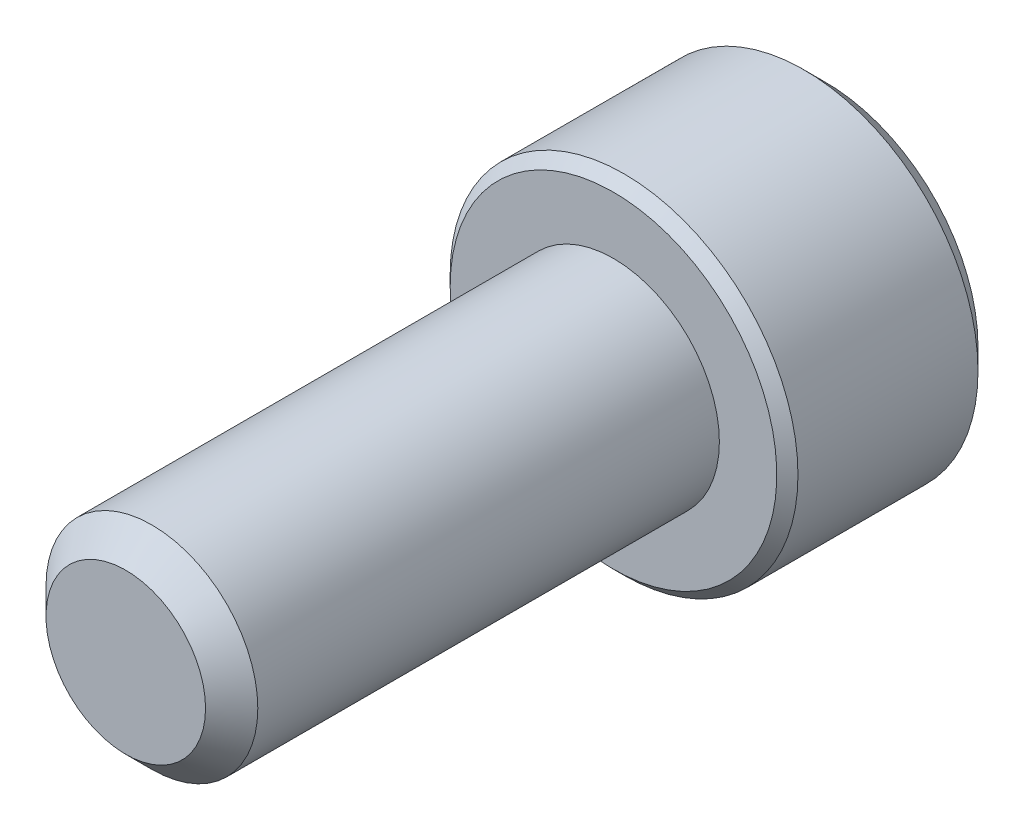
ISO-10303-21;
HEADER;
FILE_DESCRIPTION(('STEP AP214'),'2;1');
FILE_NAME('part.step','',(''),(''),'','','');
FILE_SCHEMA(('AUTOMOTIVE_DESIGN { 1 0 10303 214 1 1 1 1 }'));
ENDSEC;
DATA;
#1=APPLICATION_CONTEXT('core data for automotive mechanical design processes');
#2=APPLICATION_PROTOCOL_DEFINITION('international standard','automotive_design',2000,#1);
#3=PRODUCT_CONTEXT('',#1,'mechanical');
#4=PRODUCT('Part','Part','',(#3));
#5=PRODUCT_RELATED_PRODUCT_CATEGORY('part','',(#4));
#6=PRODUCT_DEFINITION_FORMATION('','',#4);
#7=PRODUCT_DEFINITION_CONTEXT('part definition',#1,'design');
#8=PRODUCT_DEFINITION('design','',#6,#7);
#9=PRODUCT_DEFINITION_SHAPE('','',#8);
#10=(LENGTH_UNIT() NAMED_UNIT(*) SI_UNIT(.MILLI.,.METRE.));
#11=(NAMED_UNIT(*) PLANE_ANGLE_UNIT() SI_UNIT($,.RADIAN.));
#12=(NAMED_UNIT(*) SI_UNIT($,.STERADIAN.) SOLID_ANGLE_UNIT());
#13=UNCERTAINTY_MEASURE_WITH_UNIT(LENGTH_MEASURE(1.E-05),#10,'distance_accuracy_value','');
#14=(GEOMETRIC_REPRESENTATION_CONTEXT(3) GLOBAL_UNCERTAINTY_ASSIGNED_CONTEXT((#13)) GLOBAL_UNIT_ASSIGNED_CONTEXT((#10,
#11,#12)) REPRESENTATION_CONTEXT('',''));
#15=CARTESIAN_POINT('',(0.,0.,0.));
#16=DIRECTION('',(0.,0.,1.));
#17=DIRECTION('',(1.,0.,0.));
#18=AXIS2_PLACEMENT_3D('',#15,#16,#17);
#19=CARTESIAN_POINT('',(0.,0.,-11.1125));
#20=DIRECTION('',(0.,0.,1.));
#21=DIRECTION('',(1.,0.,0.));
#22=AXIS2_PLACEMENT_3D('',#19,#20,#21);
#23=CYLINDRICAL_SURFACE('',#22,2.413);
#24=CARTESIAN_POINT('',(0.,0.,-0.595312500000004));
#25=DIRECTION('',(0.,0.,1.));
#26=DIRECTION('',(1.,0.,0.));
#27=AXIS2_PLACEMENT_3D('',#24,#25,#26);
#28=CIRCLE('',#27,2.413);
#29=CARTESIAN_POINT('',(2.413,0.,-0.595312500000004));
#30=VERTEX_POINT('',#29);
#31=EDGE_CURVE('E109',#30,#30,#28,.F.);
#32=ORIENTED_EDGE('',*,*,#31,.T.);
#33=EDGE_LOOP('',(#32));
#34=FACE_BOUND('',#33,.T.);
#35=CARTESIAN_POINT('',(0.,0.,-11.1125));
#36=DIRECTION('',(0.,0.,-1.));
#37=DIRECTION('',(-1.,0.,0.));
#38=AXIS2_PLACEMENT_3D('',#35,#36,#37);
#39=CIRCLE('',#38,2.413);
#40=CARTESIAN_POINT('',(-2.413,0.,-11.1125));
#41=VERTEX_POINT('',#40);
#42=EDGE_CURVE('E209',#41,#41,#39,.F.);
#43=ORIENTED_EDGE('',*,*,#42,.T.);
#44=EDGE_LOOP('',(#43));
#45=FACE_BOUND('',#44,.T.);
#46=ADVANCED_FACE('F35',(#34,#45),#23,.T.);
#47=CARTESIAN_POINT('',(0.,0.,0.));
#48=DIRECTION('',(0.,0.,1.));
#49=DIRECTION('',(1.,0.,0.));
#50=AXIS2_PLACEMENT_3D('',#47,#48,#49);
#51=PLANE('',#50);
#52=CARTESIAN_POINT('',(0.,0.,0.));
#53=DIRECTION('',(0.,0.,1.));
#54=DIRECTION('',(1.,0.,0.));
#55=AXIS2_PLACEMENT_3D('',#52,#53,#54);
#56=CIRCLE('',#55,1.8176875);
#57=CARTESIAN_POINT('',(1.8176875,0.,0.));
#58=VERTEX_POINT('',#57);
#59=EDGE_CURVE('E208',#58,#58,#56,.T.);
#60=ORIENTED_EDGE('',*,*,#59,.T.);
#61=EDGE_LOOP('',(#60));
#62=FACE_BOUND('',#61,.T.);
#63=ADVANCED_FACE('F186',(#62),#51,.T.);
#64=CARTESIAN_POINT('',(0.,0.,0.));
#65=DIRECTION('',(0.,0.,-1.));
#66=DIRECTION('',(-1.,0.,0.));
#67=AXIS2_PLACEMENT_3D('',#64,#65,#66);
#68=CONICAL_SURFACE('',#67,1.8176875,0.785398163397447);
#69=ORIENTED_EDGE('',*,*,#31,.F.);
#70=EDGE_LOOP('',(#69));
#71=FACE_BOUND('',#70,.T.);
#72=ORIENTED_EDGE('',*,*,#59,.F.);
#73=EDGE_LOOP('',(#72));
#74=FACE_BOUND('',#73,.T.);
#75=ADVANCED_FACE('F192',(#71,#74),#68,.T.);
#76=CARTESIAN_POINT('',(0.,0.,-15.9385));
#77=DIRECTION('',(0.,0.,1.));
#78=DIRECTION('',(1.,0.,0.));
#79=AXIS2_PLACEMENT_3D('',#76,#77,#78);
#80=CYLINDRICAL_SURFACE('',#79,3.9624);
#81=CARTESIAN_POINT('',(0.,0.,-11.3538));
#82=DIRECTION('',(0.,0.,-1.));
#83=DIRECTION('',(-1.,0.,0.));
#84=AXIS2_PLACEMENT_3D('',#81,#82,#83);
#85=CIRCLE('',#84,3.9624);
#86=CARTESIAN_POINT('',(3.9624,0.,-11.3538));
#87=VERTEX_POINT('',#86);
#88=EDGE_CURVE('E43',#87,#87,#85,.T.);
#89=CARTESIAN_POINT('',(0.,0.,-15.4559));
#90=DIRECTION('',(0.,0.,-1.));
#91=DIRECTION('',(-1.,0.,0.));
#92=AXIS2_PLACEMENT_3D('',#89,#90,#91);
#93=CIRCLE('',#92,3.9624);
#94=CARTESIAN_POINT('',(3.9624,0.,-15.4559));
#95=VERTEX_POINT('',#94);
#96=EDGE_CURVE('E169',#95,#95,#93,.F.);
#97=CARTESIAN_POINT('',(3.9624,0.,-11.3538));
#98=CARTESIAN_POINT('',(3.9624,0.,-11.3965302083333));
#99=CARTESIAN_POINT('',(3.9624,0.,-11.4392604166667));
#100=CARTESIAN_POINT('',(3.9624,0.,-11.5247208333333));
#101=CARTESIAN_POINT('',(3.9624,0.,-11.5674510416667));
#102=CARTESIAN_POINT('',(3.9624,0.,-11.6529114583333));
#103=CARTESIAN_POINT('',(3.9624,0.,-11.6956416666667));
#104=CARTESIAN_POINT('',(3.9624,0.,-11.7811020833333));
#105=CARTESIAN_POINT('',(3.9624,0.,-11.8238322916667));
#106=CARTESIAN_POINT('',(3.9624,0.,-11.9092927083333));
#107=CARTESIAN_POINT('',(3.9624,0.,-11.9520229166667));
#108=CARTESIAN_POINT('',(3.9624,0.,-12.0374833333333));
#109=CARTESIAN_POINT('',(3.9624,0.,-12.0802135416667));
#110=CARTESIAN_POINT('',(3.9624,0.,-12.1656739583333));
#111=CARTESIAN_POINT('',(3.9624,0.,-12.2084041666667));
#112=CARTESIAN_POINT('',(3.9624,0.,-12.2938645833333));
#113=CARTESIAN_POINT('',(3.9624,0.,-12.3365947916667));
#114=CARTESIAN_POINT('',(3.9624,0.,-12.4220552083333));
#115=CARTESIAN_POINT('',(3.9624,0.,-12.4647854166667));
#116=CARTESIAN_POINT('',(3.9624,0.,-12.5502458333333));
#117=CARTESIAN_POINT('',(3.9624,0.,-12.5929760416667));
#118=CARTESIAN_POINT('',(3.9624,0.,-12.6784364583333));
#119=CARTESIAN_POINT('',(3.9624,0.,-12.7211666666667));
#120=CARTESIAN_POINT('',(3.9624,0.,-12.8066270833333));
#121=CARTESIAN_POINT('',(3.9624,0.,-12.8493572916667));
#122=CARTESIAN_POINT('',(3.9624,0.,-12.9348177083333));
#123=CARTESIAN_POINT('',(3.9624,0.,-12.9775479166667));
#124=CARTESIAN_POINT('',(3.9624,0.,-13.0630083333333));
#125=CARTESIAN_POINT('',(3.9624,0.,-13.1057385416667));
#126=CARTESIAN_POINT('',(3.9624,0.,-13.1911989583333));
#127=CARTESIAN_POINT('',(3.9624,0.,-13.2339291666667));
#128=CARTESIAN_POINT('',(3.9624,0.,-13.3193895833333));
#129=CARTESIAN_POINT('',(3.9624,0.,-13.3621197916667));
#130=CARTESIAN_POINT('',(3.9624,0.,-13.4475802083333));
#131=CARTESIAN_POINT('',(3.9624,0.,-13.4903104166667));
#132=CARTESIAN_POINT('',(3.9624,0.,-13.5757708333333));
#133=CARTESIAN_POINT('',(3.9624,0.,-13.6185010416667));
#134=CARTESIAN_POINT('',(3.9624,0.,-13.7039614583333));
#135=CARTESIAN_POINT('',(3.9624,0.,-13.7466916666667));
#136=CARTESIAN_POINT('',(3.9624,0.,-13.8321520833333));
#137=CARTESIAN_POINT('',(3.9624,0.,-13.8748822916667));
#138=CARTESIAN_POINT('',(3.9624,0.,-13.9603427083333));
#139=CARTESIAN_POINT('',(3.9624,0.,-14.0030729166667));
#140=CARTESIAN_POINT('',(3.9624,0.,-14.0885333333333));
#141=CARTESIAN_POINT('',(3.9624,0.,-14.1312635416667));
#142=CARTESIAN_POINT('',(3.9624,0.,-14.2167239583333));
#143=CARTESIAN_POINT('',(3.9624,0.,-14.2594541666667));
#144=CARTESIAN_POINT('',(3.9624,0.,-14.3449145833333));
#145=CARTESIAN_POINT('',(3.9624,0.,-14.3876447916667));
#146=CARTESIAN_POINT('',(3.9624,0.,-14.4731052083333));
#147=CARTESIAN_POINT('',(3.9624,0.,-14.5158354166667));
#148=CARTESIAN_POINT('',(3.9624,0.,-14.6012958333333));
#149=CARTESIAN_POINT('',(3.9624,0.,-14.6440260416667));
#150=CARTESIAN_POINT('',(3.9624,0.,-14.7294864583333));
#151=CARTESIAN_POINT('',(3.9624,0.,-14.7722166666667));
#152=CARTESIAN_POINT('',(3.9624,0.,-14.8576770833333));
#153=CARTESIAN_POINT('',(3.9624,0.,-14.9004072916667));
#154=CARTESIAN_POINT('',(3.9624,0.,-14.9858677083333));
#155=CARTESIAN_POINT('',(3.9624,0.,-15.0285979166667));
#156=CARTESIAN_POINT('',(3.9624,0.,-15.1140583333333));
#157=CARTESIAN_POINT('',(3.9624,0.,-15.1567885416667));
#158=CARTESIAN_POINT('',(3.9624,0.,-15.2422489583333));
#159=CARTESIAN_POINT('',(3.9624,0.,-15.2849791666667));
#160=CARTESIAN_POINT('',(3.9624,0.,-15.3704395833333));
#161=CARTESIAN_POINT('',(3.9624,0.,-15.4131697916667));
#162=CARTESIAN_POINT('',(3.9624,0.,-15.4559));
#163=B_SPLINE_CURVE_WITH_KNOTS('',3,(#97,#98,#99,#100,#101,#102,#103,#104,#105,#106,#107,#108,
#109,#110,#111,#112,#113,#114,#115,#116,#117,#118,#119,#120,#121,#122,#123,#124,#125,#126,#127,
#128,#129,#130,#131,#132,#133,#134,#135,#136,#137,#138,#139,#140,#141,#142,#143,#144,#145,#146,
#147,#148,#149,#150,#151,#152,#153,#154,#155,#156,#157,#158,#159,#160,#161,#162),.UNSPECIFIED.,
.F.,.F.,(4,2,2,2,2,2,2,2,2,2,2,2,2,2,2,2,2,2,2,2,2,2,2,2,2,2,2,2,2,2,2,2,4),(0.,0.128190625,
0.256381249999998,0.384571874999998,0.512762499999998,0.640953124999998,0.769143749999998,
0.897334374999998,1.025525,1.153715625,1.28190625,1.410096875,1.5382875,1.666478125,
1.79466874999999,1.92285937499999,2.05104999999999,2.17924062499999,2.30743124999999,
2.43562187499999,2.56381249999999,2.69200312499999,2.82019374999999,2.94838437499999,
3.07657499999999,3.20476562499999,3.33295624999999,3.46114687499999,3.58933749999999,
3.71752812499999,3.84571874999999,3.97390937499999,4.10209999999999),.UNSPECIFIED.);
#164=EDGE_CURVE('BSEAM174',#87,#95,#163,.T.);
#165=ORIENTED_EDGE('',*,*,#88,.T.);
#166=ORIENTED_EDGE('',*,*,#96,.T.);
#167=ORIENTED_EDGE('',*,*,#164,.T.);
#168=ORIENTED_EDGE('',*,*,#164,.F.);
#169=EDGE_LOOP('',(#165,#167,#166,#168));
#170=FACE_BOUND('',#169,.T.);
#171=ADVANCED_FACE('F174',(#170),#80,.T.);
#172=CARTESIAN_POINT('',(0.,0.,-15.9385));
#173=DIRECTION('',(0.,0.,-1.));
#174=DIRECTION('',(-1.,0.,0.));
#175=AXIS2_PLACEMENT_3D('',#172,#173,#174);
#176=PLANE('',#175);
#177=CARTESIAN_POINT('',(0.,0.,-15.9385));
#178=DIRECTION('',(0.,0.,-1.));
#179=DIRECTION('',(-1.,0.,0.));
#180=AXIS2_PLACEMENT_3D('',#177,#178,#179);
#181=CIRCLE('',#180,3.4798);
#182=CARTESIAN_POINT('',(3.4798,0.,-15.9385));
#183=VERTEX_POINT('',#182);
#184=EDGE_CURVE('E108',#183,#183,#181,.T.);
#185=ORIENTED_EDGE('',*,*,#184,.T.);
#186=EDGE_LOOP('',(#185));
#187=FACE_BOUND('',#186,.T.);
#188=CARTESIAN_POINT('',(0.,0.,-15.9385));
#189=DIRECTION('',(0.,0.,-1.));
#190=DIRECTION('',(-1.,0.,0.));
#191=AXIS2_PLACEMENT_3D('',#188,#189,#190);
#192=CIRCLE('',#191,2.29135888084633);
#193=CARTESIAN_POINT('',(-1.984375,1.14567944042316,-15.9385));
#194=VERTEX_POINT('',#193);
#195=CARTESIAN_POINT('',(0.,2.29135888084633,-15.9385));
#196=VERTEX_POINT('',#195);
#197=EDGE_CURVE('E89',#194,#196,#192,.T.);
#198=ORIENTED_EDGE('',*,*,#197,.F.);
#199=CARTESIAN_POINT('',(-1.984375,-1.14567944042316,-15.9385));
#200=VERTEX_POINT('',#199);
#201=EDGE_CURVE('E49',#200,#194,#192,.T.);
#202=ORIENTED_EDGE('',*,*,#201,.F.);
#203=CARTESIAN_POINT('',(0.,-2.29135888084633,-15.9385));
#204=VERTEX_POINT('',#203);
#205=EDGE_CURVE('E265',#204,#200,#192,.T.);
#206=ORIENTED_EDGE('',*,*,#205,.F.);
#207=CARTESIAN_POINT('',(1.984375,-1.14567944042316,-15.9385));
#208=VERTEX_POINT('',#207);
#209=EDGE_CURVE('E56',#208,#204,#192,.T.);
#210=ORIENTED_EDGE('',*,*,#209,.F.);
#211=CARTESIAN_POINT('',(1.984375,1.14567944042316,-15.9385));
#212=VERTEX_POINT('',#211);
#213=EDGE_CURVE('E130',#212,#208,#192,.T.);
#214=ORIENTED_EDGE('',*,*,#213,.F.);
#215=EDGE_CURVE('E98',#196,#212,#192,.T.);
#216=ORIENTED_EDGE('',*,*,#215,.F.);
#217=EDGE_LOOP('',(#198,#202,#206,#210,#214,#216));
#218=FACE_BOUND('',#217,.T.);
#219=ADVANCED_FACE('F129',(#187,#218),#176,.T.);
#220=CARTESIAN_POINT('',(0.,0.,-11.1125));
#221=DIRECTION('',(0.,0.,-1.));
#222=DIRECTION('',(-1.,0.,0.));
#223=AXIS2_PLACEMENT_3D('',#220,#221,#222);
#224=PLANE('',#223);
#225=CARTESIAN_POINT('',(0.,0.,-11.1125));
#226=DIRECTION('',(0.,0.,-1.));
#227=DIRECTION('',(-1.,0.,0.));
#228=AXIS2_PLACEMENT_3D('',#225,#226,#227);
#229=CIRCLE('',#228,3.7211);
#230=CARTESIAN_POINT('',(-3.7211,0.,-11.1125));
#231=VERTEX_POINT('',#230);
#232=EDGE_CURVE('E11',#231,#231,#229,.F.);
#233=ORIENTED_EDGE('',*,*,#232,.T.);
#234=EDGE_LOOP('',(#233));
#235=FACE_BOUND('',#234,.T.);
#236=ORIENTED_EDGE('',*,*,#42,.F.);
#237=EDGE_LOOP('',(#236));
#238=FACE_BOUND('',#237,.T.);
#239=ADVANCED_FACE('F277',(#235,#238),#224,.F.);
#240=CARTESIAN_POINT('',(0.,0.,-15.9385));
#241=DIRECTION('',(0.,0.,-1.));
#242=DIRECTION('',(-1.,0.,0.));
#243=AXIS2_PLACEMENT_3D('',#240,#241,#242);
#244=CONICAL_SURFACE('',#243,2.29135888084633,0.78539816339745);
#245=ORIENTED_EDGE('',*,*,#215,.T.);
#246=CARTESIAN_POINT('',(-0.000199999999999783,2.29147435090016,-15.9386154787818));
#247=CARTESIAN_POINT('',(0.0680159951668029,2.25208982772757,-15.8992628522639));
#248=CARTESIAN_POINT('',(0.137372685106967,2.21204672412052,-15.8622213104462));
#249=CARTESIAN_POINT('',(0.278798800452188,2.13039431835551,-15.7943988584233));
#250=CARTESIAN_POINT('',(0.350881678736783,2.08877724917394,-15.7636556890918));
#251=CARTESIAN_POINT('',(0.496233397266004,2.00485839535392,-15.7109918888112));
#252=CARTESIAN_POINT('',(0.569465212486938,1.96257798712287,-15.68893887588));
#253=CARTESIAN_POINT('',(0.717541182594705,1.87708628592063,-15.6549614929439));
#254=CARTESIAN_POINT('',(0.792380812753423,1.83387760530244,-15.6430117560917));
#255=CARTESIAN_POINT('',(0.921360414543814,1.75941119748879,-15.6322300990819));
#256=CARTESIAN_POINT('',(0.975333715772441,1.72824969749539,-15.6306338990591));
#257=CARTESIAN_POINT('',(1.0831921185198,1.66597761963484,-15.6333218388653));
#258=CARTESIAN_POINT('',(1.13707718248552,1.63486706344893,-15.6376080403405));
#259=CARTESIAN_POINT('',(1.2443385382486,1.57293969082547,-15.6518168730135));
#260=CARTESIAN_POINT('',(1.29771419276014,1.54212324232506,-15.6617458104523));
#261=CARTESIAN_POINT('',(1.40354251740889,1.48102323060122,-15.6866950842745));
#262=CARTESIAN_POINT('',(1.4559952579711,1.45073962671789,-15.7017150303895));
#263=CARTESIAN_POINT('',(1.59035733896365,1.37316564308797,-15.7463078516357));
#264=CARTESIAN_POINT('',(1.67143335715832,1.32635638215845,-15.7792429959383));
#265=CARTESIAN_POINT('',(1.79064830672984,1.25752759893191,-15.8348424412022));
#266=CARTESIAN_POINT('',(1.829934924386,1.23484545965257,-15.8543775920519));
#267=CARTESIAN_POINT('',(1.90778036186805,1.18990137536713,-15.8952287381194));
#268=CARTESIAN_POINT('',(1.9463396111017,1.16763918244233,-15.9165436395683));
#269=CARTESIAN_POINT('',(1.984575,1.14556397036933,-15.9386154787818));
#270=B_SPLINE_CURVE_WITH_KNOTS('',3,(#246,#247,#248,#249,#250,#251,#252,#253,#254,#255,#256,
#257,#258,#259,#260,#261,#262,#263,#264,#265,#266,#267,#268,#269),.UNSPECIFIED.,.F.,.F.,(4,2,2,
2,2,2,2,2,2,2,2,4),(0.,0.264339630306627,0.530219665093694,0.791876416371459,1.05287424418109,
1.239639843932,1.42647091743852,1.61351120244034,1.8005371524754,2.09764209964316,
2.24579179873714,2.39385111134157),.UNSPECIFIED.);
#271=EDGE_CURVE('E103',#196,#212,#270,.T.);
#272=ORIENTED_EDGE('',*,*,#271,.F.);
#273=EDGE_LOOP('',(#245,#272));
#274=FACE_BOUND('',#273,.T.);
#275=ADVANCED_FACE('F104',(#274),#244,.F.);
#276=ORIENTED_EDGE('',*,*,#213,.T.);
#277=CARTESIAN_POINT('',(1.984375,-2.32063167832104,-16.7005122932909));
#278=CARTESIAN_POINT('',(1.984375,-2.26428478873706,-16.6576970726396));
#279=CARTESIAN_POINT('',(1.984375,-2.2076264404859,-16.6152851548598));
#280=CARTESIAN_POINT('',(1.984375,-2.09356244120113,-16.5314497614));
#281=CARTESIAN_POINT('',(1.984375,-2.03615660973826,-16.4900265314735));
#282=CARTESIAN_POINT('',(1.984375,-1.92005329549413,-16.4080556074651));
#283=CARTESIAN_POINT('',(1.984375,-1.86134925442763,-16.3675171714073));
#284=CARTESIAN_POINT('',(1.984375,-1.74295108528239,-16.2879176949279));
#285=CARTESIAN_POINT('',(1.984375,-1.68325702692775,-16.2488565510951));
#286=CARTESIAN_POINT('',(1.984375,-1.5591477373167,-16.170282507283));
#287=CARTESIAN_POINT('',(1.984375,-1.49466231059306,-16.1308799217084));
#288=CARTESIAN_POINT('',(1.984375,-1.36418150680543,-16.0546153086969));
#289=CARTESIAN_POINT('',(1.984375,-1.29818586193375,-16.0177537365827));
#290=CARTESIAN_POINT('',(1.984375,-1.16468832197213,-15.9473663044257));
#291=CARTESIAN_POINT('',(1.984375,-1.09719175474905,-15.9138304185629));
#292=CARTESIAN_POINT('',(1.984375,-0.960326048760516,-15.850838388333));
#293=CARTESIAN_POINT('',(1.984375,-0.890957548524544,-15.8213808733092));
#294=CARTESIAN_POINT('',(1.984375,-0.756350570592779,-15.7699431504382));
#295=CARTESIAN_POINT('',(1.984375,-0.691277091834669,-15.7475356001922));
#296=CARTESIAN_POINT('',(1.984375,-0.55953224434249,-15.707936438549));
#297=CARTESIAN_POINT('',(1.984375,-0.492860768840822,-15.6907451767239));
#298=CARTESIAN_POINT('',(1.984375,-0.359444340541036,-15.6627733107239));
#299=CARTESIAN_POINT('',(1.984375,-0.2927232724406,-15.6518806612626));
#300=CARTESIAN_POINT('',(1.984375,-0.158528474608846,-15.6367231339064));
#301=CARTESIAN_POINT('',(1.984375,-0.0910548851817877,-15.6324570406579));
#302=CARTESIAN_POINT('',(1.984375,0.0413650999137264,-15.6308854095573));
#303=CARTESIAN_POINT('',(1.984375,0.106308452967821,-15.6333174039186));
#304=CARTESIAN_POINT('',(1.984375,0.235655863007939,-15.6444201379429));
#305=CARTESIAN_POINT('',(1.984375,0.300059868095337,-15.6530914711624));
#306=CARTESIAN_POINT('',(1.984375,0.428953283964649,-15.6763407434725));
#307=CARTESIAN_POINT('',(1.984375,0.493424050458164,-15.6910204588315));
#308=CARTESIAN_POINT('',(1.984375,0.620952380240787,-15.7254955658159));
#309=CARTESIAN_POINT('',(1.984375,0.684010048840138,-15.7452905748402));
#310=CARTESIAN_POINT('',(1.984375,0.880940558550129,-15.8146008914478));
#311=CARTESIAN_POINT('',(1.984375,1.01205007104083,-15.871943011978));
#312=CARTESIAN_POINT('',(1.984375,1.26813381475398,-15.9994796743044));
#313=CARTESIAN_POINT('',(1.984375,1.39308407238678,-16.0697200707537));
#314=CARTESIAN_POINT('',(1.984375,1.57369086911653,-16.1793624553678));
#315=CARTESIAN_POINT('',(1.984375,1.63130328190224,-16.2156057512345));
#316=CARTESIAN_POINT('',(1.984375,1.74553911378007,-16.2896304425414));
#317=CARTESIAN_POINT('',(1.984375,1.80216245776213,-16.3274119540746));
#318=CARTESIAN_POINT('',(1.984375,1.91409137785657,-16.4039208659108));
#319=CARTESIAN_POINT('',(1.984375,1.96940390829638,-16.4426381432783));
#320=CARTESIAN_POINT('',(1.984375,2.07927192346538,-16.521101965305));
#321=CARTESIAN_POINT('',(1.984375,2.13382761241393,-16.5608482236772));
#322=CARTESIAN_POINT('',(1.984375,2.18806621147869,-16.6010161819212));
#323=B_SPLINE_CURVE_WITH_KNOTS('',3,(#277,#278,#279,#280,#281,#282,#283,#284,#285,#286,#287,
#288,#289,#290,#291,#292,#293,#294,#295,#296,#297,#298,#299,#300,#301,#302,#303,#304,#305,#306,
#307,#308,#309,#310,#311,#312,#313,#314,#315,#316,#317,#318,#319,#320,#321,#322),.UNSPECIFIED.,
.F.,.F.,(4,2,2,2,2,2,2,2,2,2,2,2,2,2,2,2,2,2,2,2,2,2,4),(0.,0.212308206697439,0.4246686475674,
0.638672731709373,0.852661807620631,1.07932739837561,1.30603350019038,1.53203394142883,
1.75795824321728,1.96424818305224,2.170551944454,2.37306294924567,2.57553680780813,
2.77019069742987,2.96486310718306,3.16297934082809,3.36108076055064,3.78913334543008,
4.21873824519345,4.4229122671498,4.62710172729377,4.8296395612553,5.03212163744055),.UNSPECIFIED.);
#324=EDGE_CURVE('E97',#212,#208,#323,.F.);
#325=ORIENTED_EDGE('',*,*,#324,.F.);
#326=EDGE_LOOP('',(#276,#325));
#327=FACE_BOUND('',#326,.T.);
#328=ADVANCED_FACE('F271',(#327),#244,.F.);
#329=ORIENTED_EDGE('',*,*,#209,.T.);
#330=CARTESIAN_POINT('',(1.984575,-1.14556397036933,-15.9386154787818));
#331=CARTESIAN_POINT('',(1.9163590048332,-1.18494849354192,-15.8992628522639));
#332=CARTESIAN_POINT('',(1.84700231489303,-1.22499159714897,-15.8622213104462));
#333=CARTESIAN_POINT('',(1.70557619954781,-1.30664400291398,-15.7943988584233));
#334=CARTESIAN_POINT('',(1.63349332126322,-1.34826107209555,-15.7636556890918));
#335=CARTESIAN_POINT('',(1.488141602734,-1.43217992591557,-15.7109918888112));
#336=CARTESIAN_POINT('',(1.41490978751306,-1.47446033414663,-15.68893887588));
#337=CARTESIAN_POINT('',(1.26683381740529,-1.55995203534886,-15.6549614929439));
#338=CARTESIAN_POINT('',(1.19199418724658,-1.60316071596705,-15.6430117560917));
#339=CARTESIAN_POINT('',(1.06301458545619,-1.6776271237807,-15.6322300990819));
#340=CARTESIAN_POINT('',(1.00904128422756,-1.7087886237741,-15.6306338990591));
#341=CARTESIAN_POINT('',(0.901182881480202,-1.77106070163465,-15.6333218388653));
#342=CARTESIAN_POINT('',(0.847297817514478,-1.80217125782056,-15.6376080403405));
#343=CARTESIAN_POINT('',(0.740036461751398,-1.86409863044402,-15.6518168730135));
#344=CARTESIAN_POINT('',(0.686660807239862,-1.89491507894443,-15.6617458104523));
#345=CARTESIAN_POINT('',(0.580832482591106,-1.95601509066827,-15.6866950842745));
#346=CARTESIAN_POINT('',(0.5283797420289,-1.9862986945516,-15.7017150303895));
#347=CARTESIAN_POINT('',(0.394017661036352,-2.06387267818152,-15.7463078516357));
#348=CARTESIAN_POINT('',(0.312941642841676,-2.11068193911104,-15.7792429959383));
#349=CARTESIAN_POINT('',(0.193726693270161,-2.17951072233758,-15.8348424412022));
#350=CARTESIAN_POINT('',(0.154440075613999,-2.20219286161692,-15.8543775920519));
#351=CARTESIAN_POINT('',(0.0765946381319474,-2.24713694590237,-15.8952287381194));
#352=CARTESIAN_POINT('',(0.0380353888983019,-2.26939913882716,-15.9165436395683));
#353=CARTESIAN_POINT('',(-0.000199999999999664,-2.29147435090017,-15.9386154787818));
#354=B_SPLINE_CURVE_WITH_KNOTS('',3,(#330,#331,#332,#333,#334,#335,#336,#337,#338,#339,#340,
#341,#342,#343,#344,#345,#346,#347,#348,#349,#350,#351,#352,#353),.UNSPECIFIED.,.F.,.F.,(4,2,2,
2,2,2,2,2,2,2,2,4),(0.,0.264339630306628,0.530219665093694,0.791876416371459,1.05287424418109,
1.239639843932,1.42647091743852,1.61351120244034,1.8005371524754,2.09764209964316,
2.24579179873714,2.39385111134157),.UNSPECIFIED.);
#355=EDGE_CURVE('E139',#208,#204,#354,.T.);
#356=ORIENTED_EDGE('',*,*,#355,.F.);
#357=EDGE_LOOP('',(#329,#356));
#358=FACE_BOUND('',#357,.T.);
#359=ADVANCED_FACE('F268',(#358),#244,.F.);
#360=ORIENTED_EDGE('',*,*,#205,.T.);
#361=CARTESIAN_POINT('',(0.000200000000000106,-2.29147435090016,-15.9386154787818));
#362=CARTESIAN_POINT('',(-0.0680159951668027,-2.25208982772757,-15.8992628522639));
#363=CARTESIAN_POINT('',(-0.137372685106966,-2.21204672412052,-15.8622213104462));
#364=CARTESIAN_POINT('',(-0.278798800452188,-2.13039431835551,-15.7943988584233));
#365=CARTESIAN_POINT('',(-0.350881678736782,-2.08877724917394,-15.7636556890918));
#366=CARTESIAN_POINT('',(-0.496233397266003,-2.00485839535392,-15.7109918888112));
#367=CARTESIAN_POINT('',(-0.569465212486938,-1.96257798712287,-15.68893887588));
#368=CARTESIAN_POINT('',(-0.717541182594705,-1.87708628592063,-15.6549614929439));
#369=CARTESIAN_POINT('',(-0.792380812753423,-1.83387760530244,-15.6430117560917));
#370=CARTESIAN_POINT('',(-0.921360414543814,-1.75941119748879,-15.6322300990819));
#371=CARTESIAN_POINT('',(-0.975333715772441,-1.72824969749539,-15.6306338990591));
#372=CARTESIAN_POINT('',(-1.0831921185198,-1.66597761963484,-15.6333218388653));
#373=CARTESIAN_POINT('',(-1.13707718248552,-1.63486706344893,-15.6376080403405));
#374=CARTESIAN_POINT('',(-1.2443385382486,-1.57293969082547,-15.6518168730135));
#375=CARTESIAN_POINT('',(-1.29771419276014,-1.54212324232506,-15.6617458104523));
#376=CARTESIAN_POINT('',(-1.40354251740889,-1.48102323060122,-15.6866950842745));
#377=CARTESIAN_POINT('',(-1.4559952579711,-1.45073962671789,-15.7017150303895));
#378=CARTESIAN_POINT('',(-1.59035733896365,-1.37316564308797,-15.7463078516357));
#379=CARTESIAN_POINT('',(-1.67143335715832,-1.32635638215845,-15.7792429959383));
#380=CARTESIAN_POINT('',(-1.79064830672984,-1.25752759893191,-15.8348424412022));
#381=CARTESIAN_POINT('',(-1.829934924386,-1.23484545965257,-15.8543775920519));
#382=CARTESIAN_POINT('',(-1.90778036186805,-1.18990137536713,-15.8952287381194));
#383=CARTESIAN_POINT('',(-1.9463396111017,-1.16763918244233,-15.9165436395683));
#384=CARTESIAN_POINT('',(-1.984575,-1.14556397036933,-15.9386154787818));
#385=B_SPLINE_CURVE_WITH_KNOTS('',3,(#361,#362,#363,#364,#365,#366,#367,#368,#369,#370,#371,
#372,#373,#374,#375,#376,#377,#378,#379,#380,#381,#382,#383,#384),.UNSPECIFIED.,.F.,.F.,(4,2,2,
2,2,2,2,2,2,2,2,4),(0.,0.264339630306627,0.530219665093694,0.791876416371459,1.05287424418109,
1.239639843932,1.42647091743852,1.61351120244034,1.8005371524754,2.09764209964316,
2.24579179873713,2.39385111134157),.UNSPECIFIED.);
#386=EDGE_CURVE('E243',#204,#200,#385,.T.);
#387=ORIENTED_EDGE('',*,*,#386,.F.);
#388=EDGE_LOOP('',(#360,#387));
#389=FACE_BOUND('',#388,.T.);
#390=ADVANCED_FACE('F267',(#389),#244,.F.);
#391=ORIENTED_EDGE('',*,*,#201,.T.);
#392=CARTESIAN_POINT('',(-1.984375,-2.32063167841241,-16.7005122933603));
#393=CARTESIAN_POINT('',(-1.984375,-2.26428478882584,-16.6576970727064));
#394=CARTESIAN_POINT('',(-1.984375,-2.20762644057208,-16.6152851549239));
#395=CARTESIAN_POINT('',(-1.984375,-2.09356244128209,-16.5314497614587));
#396=CARTESIAN_POINT('',(-1.984375,-2.03615660981659,-16.4900265315296));
#397=CARTESIAN_POINT('',(-1.984375,-1.92005329556713,-16.4080556075158));
#398=CARTESIAN_POINT('',(-1.984375,-1.86134925449792,-16.3675171714553));
#399=CARTESIAN_POINT('',(-1.984375,-1.74295108534721,-16.2879176949706));
#400=CARTESIAN_POINT('',(-1.984375,-1.68325702698981,-16.2488565511353));
#401=CARTESIAN_POINT('',(-1.984375,-1.55914773737281,-16.1702825073177));
#402=CARTESIAN_POINT('',(-1.984375,-1.49466231064596,-16.1308799217402));
#403=CARTESIAN_POINT('',(-1.984375,-1.36418150685181,-16.0546153087231));
#404=CARTESIAN_POINT('',(-1.984375,-1.29818586197681,-16.0177537366062));
#405=CARTESIAN_POINT('',(-1.984375,-1.16468832200844,-15.947366304444));
#406=CARTESIAN_POINT('',(-1.984375,-1.09719175478193,-15.9138304185787));
#407=CARTESIAN_POINT('',(-1.984375,-0.96032604878634,-15.8508383883442));
#408=CARTESIAN_POINT('',(-1.984375,-0.890957548546747,-15.8213808733182));
#409=CARTESIAN_POINT('',(-1.984375,-0.756350570613434,-15.7699431504457));
#410=CARTESIAN_POINT('',(-1.984375,-0.69127709185756,-15.7475356001998));
#411=CARTESIAN_POINT('',(-1.984375,-0.559532244369927,-15.7079364385565));
#412=CARTESIAN_POINT('',(-1.984375,-0.492860768870571,-15.6907451767311));
#413=CARTESIAN_POINT('',(-1.984375,-0.359444340575334,-15.6627733107301));
#414=CARTESIAN_POINT('',(-1.984375,-0.292723272477133,-15.651880661268));
#415=CARTESIAN_POINT('',(-1.984375,-0.158528474649783,-15.6367231339098));
#416=CARTESIAN_POINT('',(-1.984375,-0.0910548852248912,-15.6324570406599));
#417=CARTESIAN_POINT('',(-1.984375,0.0413650998667339,-15.6308854095564));
#418=CARTESIAN_POINT('',(-1.984375,0.1063084529191,-15.6333174039161));
#419=CARTESIAN_POINT('',(-1.984375,0.235655862955942,-15.6444201379368));
#420=CARTESIAN_POINT('',(-1.984375,0.300059868041792,-15.6530914711544));
#421=CARTESIAN_POINT('',(-1.984375,0.428953283908047,-15.6763407434606));
#422=CARTESIAN_POINT('',(-1.984375,0.493424050400058,-15.6910204588175));
#423=CARTESIAN_POINT('',(-1.984375,0.620952380179824,-15.7254955657978));
#424=CARTESIAN_POINT('',(-1.984375,0.684010048777822,-15.7452905748199));
#425=CARTESIAN_POINT('',(-1.984375,0.880940558474362,-15.8146008914176));
#426=CARTESIAN_POINT('',(-1.984375,1.01205007095364,-15.8719430119387));
#427=CARTESIAN_POINT('',(-1.984375,1.26813381464481,-15.9994796742459));
#428=CARTESIAN_POINT('',(-1.984375,1.39308407226708,-16.069720070685));
#429=CARTESIAN_POINT('',(-1.984375,1.5736908689822,-16.1793624552843));
#430=CARTESIAN_POINT('',(-1.984375,1.63130328176363,-16.2156057511465));
#431=CARTESIAN_POINT('',(-1.984375,1.74553911363297,-16.2896304424442));
#432=CARTESIAN_POINT('',(-1.984375,1.80216245761082,-16.3274119539728));
#433=CARTESIAN_POINT('',(-1.984375,1.91409137769693,-16.4039208658));
#434=CARTESIAN_POINT('',(-1.984375,1.96940390813262,-16.4426381431629));
#435=CARTESIAN_POINT('',(-1.984375,2.07927192329342,-16.5211019651806));
#436=CARTESIAN_POINT('',(-1.984375,2.13382761223788,-16.5608482235483));
#437=CARTESIAN_POINT('',(-1.984375,2.18806621129856,-16.6010161817877));
#438=B_SPLINE_CURVE_WITH_KNOTS('',3,(#392,#393,#394,#395,#396,#397,#398,#399,#400,#401,#402,
#403,#404,#405,#406,#407,#408,#409,#410,#411,#412,#413,#414,#415,#416,#417,#418,#419,#420,#421,
#422,#423,#424,#425,#426,#427,#428,#429,#430,#431,#432,#433,#434,#435,#436,#437),.UNSPECIFIED.,
.F.,.F.,(4,2,2,2,2,2,2,2,2,2,2,2,2,2,2,2,2,2,2,2,2,2,4),(0.,0.212308206708486,0.424668647589499,
0.638672731742731,0.852661807665247,1.07932739843287,1.30603350026028,1.53203394151127,
1.75795824331225,1.96424818314071,2.170551944536,2.37306294932147,2.57553680787772,
2.77019069749411,2.96486310724195,3.16297934088121,3.36108076059799,3.78913334543527,
4.2187382451562,4.42291226709441,4.62710172722023,4.82963956116387,5.03212163733123),.UNSPECIFIED.);
#439=EDGE_CURVE('E119',#200,#194,#438,.T.);
#440=ORIENTED_EDGE('',*,*,#439,.F.);
#441=EDGE_LOOP('',(#391,#440));
#442=FACE_BOUND('',#441,.T.);
#443=ADVANCED_FACE('F284',(#442),#244,.F.);
#444=ORIENTED_EDGE('',*,*,#197,.T.);
#445=CARTESIAN_POINT('',(-1.984575,1.14556397036933,-15.9386154787818));
#446=CARTESIAN_POINT('',(-1.9163590048332,1.18494849354192,-15.8992628522639));
#447=CARTESIAN_POINT('',(-1.84700231489303,1.22499159714897,-15.8622213104462));
#448=CARTESIAN_POINT('',(-1.70557619954781,1.30664400291398,-15.7943988584233));
#449=CARTESIAN_POINT('',(-1.63349332126322,1.34826107209555,-15.7636556890918));
#450=CARTESIAN_POINT('',(-1.488141602734,1.43217992591557,-15.7109918888112));
#451=CARTESIAN_POINT('',(-1.41490978751306,1.47446033414662,-15.68893887588));
#452=CARTESIAN_POINT('',(-1.2668338174053,1.55995203534886,-15.6549614929439));
#453=CARTESIAN_POINT('',(-1.19199418724658,1.60316071596705,-15.6430117560917));
#454=CARTESIAN_POINT('',(-1.06301458545619,1.6776271237807,-15.6322300990819));
#455=CARTESIAN_POINT('',(-1.00904128422756,1.7087886237741,-15.6306338990591));
#456=CARTESIAN_POINT('',(-0.901182881480201,1.77106070163465,-15.6333218388653));
#457=CARTESIAN_POINT('',(-0.847297817514479,1.80217125782056,-15.6376080403405));
#458=CARTESIAN_POINT('',(-0.740036461751398,1.86409863044402,-15.6518168730135));
#459=CARTESIAN_POINT('',(-0.686660807239862,1.89491507894443,-15.6617458104523));
#460=CARTESIAN_POINT('',(-0.580832482591106,1.95601509066827,-15.6866950842745));
#461=CARTESIAN_POINT('',(-0.528379742028901,1.9862986945516,-15.7017150303895));
#462=CARTESIAN_POINT('',(-0.394017661036353,2.06387267818152,-15.7463078516357));
#463=CARTESIAN_POINT('',(-0.312941642841677,2.11068193911104,-15.7792429959383));
#464=CARTESIAN_POINT('',(-0.193726693270162,2.17951072233758,-15.8348424412022));
#465=CARTESIAN_POINT('',(-0.154440075614,2.20219286161692,-15.8543775920519));
#466=CARTESIAN_POINT('',(-0.0765946381319482,2.24713694590236,-15.8952287381194));
#467=CARTESIAN_POINT('',(-0.0380353888983017,2.26939913882716,-15.9165436395683));
#468=CARTESIAN_POINT('',(0.000200000000000052,2.29147435090017,-15.9386154787818));
#469=B_SPLINE_CURVE_WITH_KNOTS('',3,(#445,#446,#447,#448,#449,#450,#451,#452,#453,#454,#455,
#456,#457,#458,#459,#460,#461,#462,#463,#464,#465,#466,#467,#468),.UNSPECIFIED.,.F.,.F.,(4,2,2,
2,2,2,2,2,2,2,2,4),(0.,0.264339630306627,0.530219665093693,0.791876416371458,1.05287424418109,
1.239639843932,1.42647091743852,1.61351120244034,1.8005371524754,2.09764209964316,
2.24579179873713,2.39385111134157),.UNSPECIFIED.);
#470=EDGE_CURVE('E93',#194,#196,#469,.T.);
#471=ORIENTED_EDGE('',*,*,#470,.F.);
#472=EDGE_LOOP('',(#444,#471));
#473=FACE_BOUND('',#472,.T.);
#474=ADVANCED_FACE('F91',(#473),#244,.F.);
#475=CARTESIAN_POINT('',(1.984375,3.43703832126949,-12.9619375));
#476=DIRECTION('',(0.,0.,-1.));
#477=DIRECTION('',(-1.,0.,0.));
#478=AXIS2_PLACEMENT_3D('',#475,#476,#477);
#479=PLANE('',#478);
#480=DIRECTION('',(0.866025403784439,0.5,0.));
#481=VECTOR('',#480,1.);
#482=CARTESIAN_POINT('',(-1.984375,1.14567944042316,-12.9619375));
#483=LINE('',#482,#481);
#484=CARTESIAN_POINT('',(-1.984375,1.14567944042316,-12.9619375));
#485=VERTEX_POINT('',#484);
#486=CARTESIAN_POINT('',(0.,2.29135888084633,-12.9619375));
#487=VERTEX_POINT('',#486);
#488=EDGE_CURVE('E118',#485,#487,#483,.T.);
#489=ORIENTED_EDGE('',*,*,#488,.T.);
#490=DIRECTION('',(0.866025403784439,-0.5,0.));
#491=VECTOR('',#490,1.);
#492=CARTESIAN_POINT('',(0.,2.29135888084633,-12.9619375));
#493=LINE('',#492,#491);
#494=CARTESIAN_POINT('',(1.984375,1.14567944042316,-12.9619375));
#495=VERTEX_POINT('',#494);
#496=EDGE_CURVE('E123',#487,#495,#493,.T.);
#497=ORIENTED_EDGE('',*,*,#496,.T.);
#498=DIRECTION('',(0.,-1.,0.));
#499=VECTOR('',#498,1.);
#500=CARTESIAN_POINT('',(1.984375,1.14567944042316,-12.9619375));
#501=LINE('',#500,#499);
#502=CARTESIAN_POINT('',(1.984375,-1.14567944042316,-12.9619375));
#503=VERTEX_POINT('',#502);
#504=EDGE_CURVE('E231',#495,#503,#501,.T.);
#505=ORIENTED_EDGE('',*,*,#504,.T.);
#506=DIRECTION('',(-0.866025403784439,-0.5,0.));
#507=VECTOR('',#506,1.);
#508=CARTESIAN_POINT('',(1.984375,-1.14567944042316,-12.9619375));
#509=LINE('',#508,#507);
#510=CARTESIAN_POINT('',(0.,-2.29135888084633,-12.9619375));
#511=VERTEX_POINT('',#510);
#512=EDGE_CURVE('E228',#503,#511,#509,.T.);
#513=ORIENTED_EDGE('',*,*,#512,.T.);
#514=DIRECTION('',(-0.866025403784439,0.5,0.));
#515=VECTOR('',#514,1.);
#516=CARTESIAN_POINT('',(0.,-2.29135888084633,-12.9619375));
#517=LINE('',#516,#515);
#518=CARTESIAN_POINT('',(-1.984375,-1.14567944042316,-12.9619375));
#519=VERTEX_POINT('',#518);
#520=EDGE_CURVE('E225',#511,#519,#517,.T.);
#521=ORIENTED_EDGE('',*,*,#520,.T.);
#522=DIRECTION('',(0.,1.,0.));
#523=VECTOR('',#522,1.);
#524=CARTESIAN_POINT('',(-1.984375,-1.14567944042316,-12.9619375));
#525=LINE('',#524,#523);
#526=EDGE_CURVE('E126',#519,#485,#525,.T.);
#527=ORIENTED_EDGE('',*,*,#526,.T.);
#528=EDGE_LOOP('',(#489,#497,#505,#513,#521,#527));
#529=FACE_BOUND('',#528,.T.);
#530=ADVANCED_FACE('F158',(#529),#479,.T.);
#531=CARTESIAN_POINT('',(0.,2.29135888084633,-12.9619375));
#532=DIRECTION('',(0.5,0.866025403784439,0.));
#533=DIRECTION('',(-0.866025403784439,0.5,0.));
#534=AXIS2_PLACEMENT_3D('',#531,#532,#533);
#535=PLANE('',#534);
#536=DIRECTION('',(0.,0.,-1.));
#537=VECTOR('',#536,1.);
#538=CARTESIAN_POINT('',(0.,2.29135888084633,-12.9619375));
#539=LINE('',#538,#537);
#540=EDGE_CURVE('E115',#487,#196,#539,.T.);
#541=ORIENTED_EDGE('',*,*,#540,.T.);
#542=ORIENTED_EDGE('',*,*,#271,.T.);
#543=DIRECTION('',(0.,0.,-1.));
#544=VECTOR('',#543,1.);
#545=CARTESIAN_POINT('',(1.984375,1.14567944042316,-12.9619375));
#546=LINE('',#545,#544);
#547=EDGE_CURVE('E125',#495,#212,#546,.T.);
#548=ORIENTED_EDGE('',*,*,#547,.F.);
#549=ORIENTED_EDGE('',*,*,#496,.F.);
#550=EDGE_LOOP('',(#541,#542,#548,#549));
#551=FACE_BOUND('',#550,.T.);
#552=ADVANCED_FACE('F121',(#551),#535,.F.);
#553=CARTESIAN_POINT('',(1.984375,1.14567944042316,-12.9619375));
#554=DIRECTION('',(1.,0.,0.));
#555=DIRECTION('',(0.,0.,-1.));
#556=AXIS2_PLACEMENT_3D('',#553,#554,#555);
#557=PLANE('',#556);
#558=ORIENTED_EDGE('',*,*,#547,.T.);
#559=ORIENTED_EDGE('',*,*,#324,.T.);
#560=DIRECTION('',(0.,0.,-1.));
#561=VECTOR('',#560,1.);
#562=CARTESIAN_POINT('',(1.984375,-1.14567944042316,-12.9619375));
#563=LINE('',#562,#561);
#564=EDGE_CURVE('E214',#503,#208,#563,.T.);
#565=ORIENTED_EDGE('',*,*,#564,.F.);
#566=ORIENTED_EDGE('',*,*,#504,.F.);
#567=EDGE_LOOP('',(#558,#559,#565,#566));
#568=FACE_BOUND('',#567,.T.);
#569=ADVANCED_FACE('F147',(#568),#557,.F.);
#570=CARTESIAN_POINT('',(1.984375,-1.14567944042316,-12.9619375));
#571=DIRECTION('',(0.5,-0.866025403784439,0.));
#572=DIRECTION('',(0.866025403784439,0.5,0.));
#573=AXIS2_PLACEMENT_3D('',#570,#571,#572);
#574=PLANE('',#573);
#575=ORIENTED_EDGE('',*,*,#564,.T.);
#576=ORIENTED_EDGE('',*,*,#355,.T.);
#577=DIRECTION('',(0.,0.,-1.));
#578=VECTOR('',#577,1.);
#579=CARTESIAN_POINT('',(0.,-2.29135888084633,-12.9619375));
#580=LINE('',#579,#578);
#581=EDGE_CURVE('E217',#511,#204,#580,.T.);
#582=ORIENTED_EDGE('',*,*,#581,.F.);
#583=ORIENTED_EDGE('',*,*,#512,.F.);
#584=EDGE_LOOP('',(#575,#576,#582,#583));
#585=FACE_BOUND('',#584,.T.);
#586=ADVANCED_FACE('F151',(#585),#574,.F.);
#587=CARTESIAN_POINT('',(0.,-2.29135888084633,-12.9619375));
#588=DIRECTION('',(-0.5,-0.866025403784439,0.));
#589=DIRECTION('',(0.866025403784439,-0.5,0.));
#590=AXIS2_PLACEMENT_3D('',#587,#588,#589);
#591=PLANE('',#590);
#592=ORIENTED_EDGE('',*,*,#581,.T.);
#593=ORIENTED_EDGE('',*,*,#386,.T.);
#594=DIRECTION('',(0.,0.,-1.));
#595=VECTOR('',#594,1.);
#596=CARTESIAN_POINT('',(-1.984375,-1.14567944042316,-12.9619375));
#597=LINE('',#596,#595);
#598=EDGE_CURVE('E220',#519,#200,#597,.T.);
#599=ORIENTED_EDGE('',*,*,#598,.F.);
#600=ORIENTED_EDGE('',*,*,#520,.F.);
#601=EDGE_LOOP('',(#592,#593,#599,#600));
#602=FACE_BOUND('',#601,.T.);
#603=ADVANCED_FACE('F250',(#602),#591,.F.);
#604=CARTESIAN_POINT('',(-1.984375,-1.14567944042316,-12.9619375));
#605=DIRECTION('',(-1.,0.,0.));
#606=DIRECTION('',(0.,-1.,0.));
#607=AXIS2_PLACEMENT_3D('',#604,#605,#606);
#608=PLANE('',#607);
#609=ORIENTED_EDGE('',*,*,#598,.T.);
#610=ORIENTED_EDGE('',*,*,#439,.T.);
#611=DIRECTION('',(0.,0.,-1.));
#612=VECTOR('',#611,1.);
#613=CARTESIAN_POINT('',(-1.984375,1.14567944042316,-12.9619375));
#614=LINE('',#613,#612);
#615=EDGE_CURVE('E117',#485,#194,#614,.T.);
#616=ORIENTED_EDGE('',*,*,#615,.F.);
#617=ORIENTED_EDGE('',*,*,#526,.F.);
#618=EDGE_LOOP('',(#609,#610,#616,#617));
#619=FACE_BOUND('',#618,.T.);
#620=ADVANCED_FACE('F247',(#619),#608,.F.);
#621=CARTESIAN_POINT('',(-1.984375,1.14567944042316,-12.9619375));
#622=DIRECTION('',(-0.5,0.866025403784439,0.));
#623=DIRECTION('',(-0.866025403784439,-0.5,0.));
#624=AXIS2_PLACEMENT_3D('',#621,#622,#623);
#625=PLANE('',#624);
#626=ORIENTED_EDGE('',*,*,#615,.T.);
#627=ORIENTED_EDGE('',*,*,#470,.T.);
#628=ORIENTED_EDGE('',*,*,#540,.F.);
#629=ORIENTED_EDGE('',*,*,#488,.F.);
#630=EDGE_LOOP('',(#626,#627,#628,#629));
#631=FACE_BOUND('',#630,.T.);
#632=ADVANCED_FACE('F113',(#631),#625,.F.);
#633=CARTESIAN_POINT('',(0.,0.,-15.9385));
#634=DIRECTION('',(0.,0.,1.));
#635=DIRECTION('',(1.,0.,0.));
#636=AXIS2_PLACEMENT_3D('',#633,#634,#635);
#637=CONICAL_SURFACE('',#636,3.4798,0.785398163397443);
#638=CARTESIAN_POINT('',(3.9624,0.,-15.4559));
#639=CARTESIAN_POINT('',(3.95737291666667,0.,-15.4609270833333));
#640=CARTESIAN_POINT('',(3.95234583333333,0.,-15.4659541666667));
#641=CARTESIAN_POINT('',(3.94229166666667,0.,-15.4760083333333));
#642=CARTESIAN_POINT('',(3.93726458333333,0.,-15.4810354166667));
#643=CARTESIAN_POINT('',(3.92721041666667,0.,-15.4910895833333));
#644=CARTESIAN_POINT('',(3.92218333333333,0.,-15.4961166666667));
#645=CARTESIAN_POINT('',(3.91212916666667,0.,-15.5061708333333));
#646=CARTESIAN_POINT('',(3.90710208333333,0.,-15.5111979166667));
#647=CARTESIAN_POINT('',(3.89704791666667,0.,-15.5212520833333));
#648=CARTESIAN_POINT('',(3.89202083333333,0.,-15.5262791666667));
#649=CARTESIAN_POINT('',(3.88196666666667,0.,-15.5363333333333));
#650=CARTESIAN_POINT('',(3.87693958333333,0.,-15.5413604166667));
#651=CARTESIAN_POINT('',(3.86688541666667,0.,-15.5514145833333));
#652=CARTESIAN_POINT('',(3.86185833333333,0.,-15.5564416666667));
#653=CARTESIAN_POINT('',(3.85180416666667,0.,-15.5664958333333));
#654=CARTESIAN_POINT('',(3.84677708333333,0.,-15.5715229166667));
#655=CARTESIAN_POINT('',(3.83672291666667,0.,-15.5815770833333));
#656=CARTESIAN_POINT('',(3.83169583333333,0.,-15.5866041666667));
#657=CARTESIAN_POINT('',(3.82164166666667,0.,-15.5966583333333));
#658=CARTESIAN_POINT('',(3.81661458333333,0.,-15.6016854166667));
#659=CARTESIAN_POINT('',(3.80656041666667,0.,-15.6117395833333));
#660=CARTESIAN_POINT('',(3.80153333333333,0.,-15.6167666666667));
#661=CARTESIAN_POINT('',(3.79147916666667,0.,-15.6268208333333));
#662=CARTESIAN_POINT('',(3.78645208333333,0.,-15.6318479166667));
#663=CARTESIAN_POINT('',(3.77639791666667,0.,-15.6419020833333));
#664=CARTESIAN_POINT('',(3.77137083333333,0.,-15.6469291666667));
#665=CARTESIAN_POINT('',(3.76131666666667,0.,-15.6569833333333));
#666=CARTESIAN_POINT('',(3.75628958333333,0.,-15.6620104166667));
#667=CARTESIAN_POINT('',(3.74623541666667,0.,-15.6720645833333));
#668=CARTESIAN_POINT('',(3.74120833333333,0.,-15.6770916666667));
#669=CARTESIAN_POINT('',(3.73115416666667,0.,-15.6871458333333));
#670=CARTESIAN_POINT('',(3.72612708333333,0.,-15.6921729166667));
#671=CARTESIAN_POINT('',(3.71607291666667,0.,-15.7022270833333));
#672=CARTESIAN_POINT('',(3.71104583333333,0.,-15.7072541666667));
#673=CARTESIAN_POINT('',(3.70099166666667,0.,-15.7173083333333));
#674=CARTESIAN_POINT('',(3.69596458333333,0.,-15.7223354166667));
#675=CARTESIAN_POINT('',(3.68591041666667,0.,-15.7323895833333));
#676=CARTESIAN_POINT('',(3.68088333333333,0.,-15.7374166666667));
#677=CARTESIAN_POINT('',(3.67082916666667,0.,-15.7474708333333));
#678=CARTESIAN_POINT('',(3.66580208333333,0.,-15.7524979166667));
#679=CARTESIAN_POINT('',(3.65574791666667,0.,-15.7625520833333));
#680=CARTESIAN_POINT('',(3.65072083333333,0.,-15.7675791666667));
#681=CARTESIAN_POINT('',(3.64066666666667,0.,-15.7776333333333));
#682=CARTESIAN_POINT('',(3.63563958333333,0.,-15.7826604166667));
#683=CARTESIAN_POINT('',(3.62558541666667,0.,-15.7927145833333));
#684=CARTESIAN_POINT('',(3.62055833333333,0.,-15.7977416666667));
#685=CARTESIAN_POINT('',(3.61050416666667,0.,-15.8077958333333));
#686=CARTESIAN_POINT('',(3.60547708333333,0.,-15.8128229166667));
#687=CARTESIAN_POINT('',(3.59542291666667,0.,-15.8228770833333));
#688=CARTESIAN_POINT('',(3.59039583333333,0.,-15.8279041666667));
#689=CARTESIAN_POINT('',(3.58034166666667,0.,-15.8379583333333));
#690=CARTESIAN_POINT('',(3.57531458333333,0.,-15.8429854166667));
#691=CARTESIAN_POINT('',(3.56526041666667,0.,-15.8530395833333));
#692=CARTESIAN_POINT('',(3.56023333333333,0.,-15.8580666666667));
#693=CARTESIAN_POINT('',(3.55017916666667,0.,-15.8681208333333));
#694=CARTESIAN_POINT('',(3.54515208333333,0.,-15.8731479166667));
#695=CARTESIAN_POINT('',(3.53509791666667,0.,-15.8832020833333));
#696=CARTESIAN_POINT('',(3.53007083333333,0.,-15.8882291666667));
#697=CARTESIAN_POINT('',(3.52001666666667,0.,-15.8982833333333));
#698=CARTESIAN_POINT('',(3.51498958333333,0.,-15.9033104166667));
#699=CARTESIAN_POINT('',(3.50493541666667,0.,-15.9133645833333));
#700=CARTESIAN_POINT('',(3.49990833333333,0.,-15.9183916666667));
#701=CARTESIAN_POINT('',(3.48985416666667,0.,-15.9284458333333));
#702=CARTESIAN_POINT('',(3.48482708333333,0.,-15.9334729166667));
#703=CARTESIAN_POINT('',(3.4798,0.,-15.9385));
#704=B_SPLINE_CURVE_WITH_KNOTS('',3,(#638,#639,#640,#641,#642,#643,#644,#645,#646,#647,#648,
#649,#650,#651,#652,#653,#654,#655,#656,#657,#658,#659,#660,#661,#662,#663,#664,#665,#666,#667,
#668,#669,#670,#671,#672,#673,#674,#675,#676,#677,#678,#679,#680,#681,#682,#683,#684,#685,#686,
#687,#688,#689,#690,#691,#692,#693,#694,#695,#696,#697,#698,#699,#700,#701,#702,#703),
.UNSPECIFIED.,.F.,.F.,(4,2,2,2,2,2,2,2,2,2,2,2,2,2,2,2,2,2,2,2,2,2,2,2,2,2,2,2,2,2,2,2,4),(0.,
0.0213281082875405,0.0426562165750797,0.0639843248626189,0.0853124331501581,0.106640541437697,
0.127968649725237,0.149296758012776,0.170624866300315,0.191952974587854,0.213281082875395,
0.234609191162934,0.255937299450472,0.277265407738011,0.298593516025553,0.319921624313092,
0.341249732600632,0.362577840888171,0.38390594917571,0.405234057463249,0.426562165750789,
0.447890274038328,0.469218382325867,0.490546490613406,0.511874598900946,0.533202707188485,
0.554530815476024,0.575858923763564,0.597187032051103,0.618515140338642,0.639843248626181,
0.661171356913721,0.682499465201262),.UNSPECIFIED.);
#705=EDGE_CURVE('BSEAM178',#95,#183,#704,.T.);
#706=ORIENTED_EDGE('',*,*,#96,.F.);
#707=ORIENTED_EDGE('',*,*,#184,.F.);
#708=ORIENTED_EDGE('',*,*,#705,.T.);
#709=ORIENTED_EDGE('',*,*,#705,.F.);
#710=EDGE_LOOP('',(#706,#708,#707,#709));
#711=FACE_BOUND('',#710,.T.);
#712=ADVANCED_FACE('F178',(#711),#637,.T.);
#713=CARTESIAN_POINT('',(0.,0.,-11.3538));
#714=DIRECTION('',(0.,0.,-1.));
#715=DIRECTION('',(-1.,0.,0.));
#716=AXIS2_PLACEMENT_3D('',#713,#714,#715);
#717=CONICAL_SURFACE('',#716,3.9624,0.785398163397445);
#718=ORIENTED_EDGE('',*,*,#232,.F.);
#719=EDGE_LOOP('',(#718));
#720=FACE_BOUND('',#719,.T.);
#721=ORIENTED_EDGE('',*,*,#88,.F.);
#722=EDGE_LOOP('',(#721));
#723=FACE_BOUND('',#722,.T.);
#724=ADVANCED_FACE('F37',(#720,#723),#717,.T.);
#725=CLOSED_SHELL('',(#46,#63,#75,#171,#219,#239,#275,#328,#359,#390,#443,#474,#530,#552,#569,
#586,#603,#620,#632,#712,#724));
#726=MANIFOLD_SOLID_BREP('B2',#725);
#727=ADVANCED_BREP_SHAPE_REPRESENTATION('',(#18,#726),#14);
#728=SHAPE_DEFINITION_REPRESENTATION(#9,#727);
ENDSEC;
END-ISO-10303-21;
